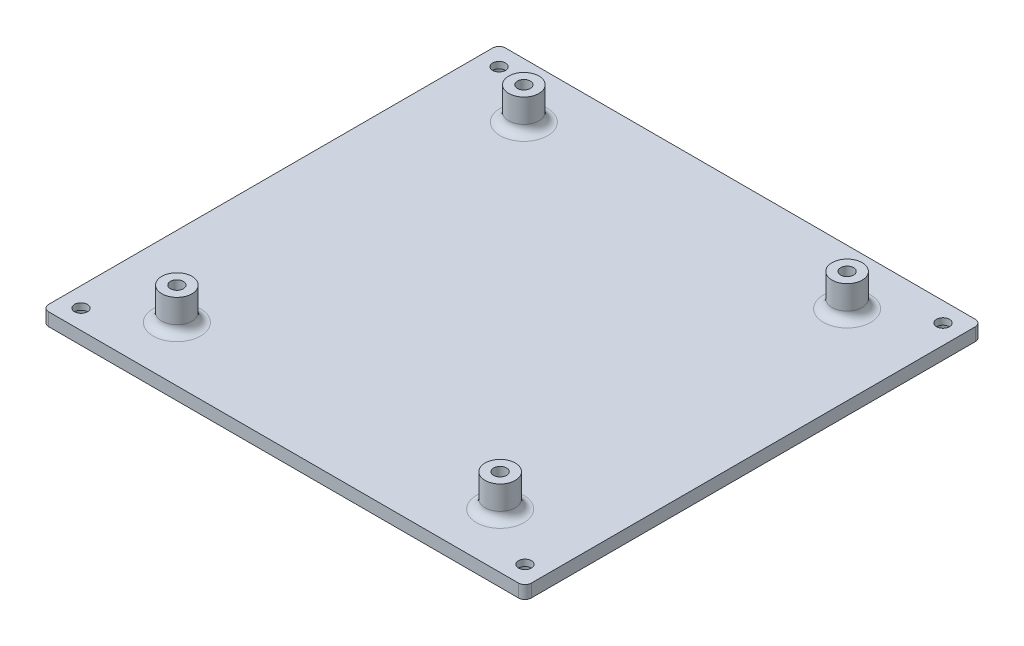
ISO-10303-21;
HEADER;
FILE_DESCRIPTION(('STEP AP214'),'2;1');
FILE_NAME('part.step','',(''),(''),'','','');
FILE_SCHEMA(('AUTOMOTIVE_DESIGN { 1 0 10303 214 1 1 1 1 }'));
ENDSEC;
DATA;
#1=APPLICATION_CONTEXT('core data for automotive mechanical design processes');
#2=APPLICATION_PROTOCOL_DEFINITION('international standard','automotive_design',2000,#1);
#3=PRODUCT_CONTEXT('',#1,'mechanical');
#4=PRODUCT('Part','Part','',(#3));
#5=PRODUCT_RELATED_PRODUCT_CATEGORY('part','',(#4));
#6=PRODUCT_DEFINITION_FORMATION('','',#4);
#7=PRODUCT_DEFINITION_CONTEXT('part definition',#1,'design');
#8=PRODUCT_DEFINITION('design','',#6,#7);
#9=PRODUCT_DEFINITION_SHAPE('','',#8);
#10=(LENGTH_UNIT() NAMED_UNIT(*) SI_UNIT(.MILLI.,.METRE.));
#11=(NAMED_UNIT(*) PLANE_ANGLE_UNIT() SI_UNIT($,.RADIAN.));
#12=(NAMED_UNIT(*) SI_UNIT($,.STERADIAN.) SOLID_ANGLE_UNIT());
#13=UNCERTAINTY_MEASURE_WITH_UNIT(LENGTH_MEASURE(1.E-05),#10,'distance_accuracy_value','');
#14=(GEOMETRIC_REPRESENTATION_CONTEXT(3) GLOBAL_UNCERTAINTY_ASSIGNED_CONTEXT((#13)) GLOBAL_UNIT_ASSIGNED_CONTEXT((#10,
#11,#12)) REPRESENTATION_CONTEXT('',''));
#15=CARTESIAN_POINT('',(0.,0.,0.));
#16=DIRECTION('',(0.,0.,1.));
#17=DIRECTION('',(1.,0.,0.));
#18=AXIS2_PLACEMENT_3D('',#15,#16,#17);
#19=CARTESIAN_POINT('',(-51.5,0.,-48.5));
#20=DIRECTION('',(0.,1.,0.));
#21=DIRECTION('',(0.,0.,1.));
#22=AXIS2_PLACEMENT_3D('',#19,#20,#21);
#23=CYLINDRICAL_SURFACE('',#22,1.5);
#24=CARTESIAN_POINT('',(-51.5,3.,-48.5));
#25=DIRECTION('',(0.,1.,0.));
#26=DIRECTION('',(0.,0.,1.));
#27=AXIS2_PLACEMENT_3D('',#24,#25,#26);
#28=CIRCLE('',#27,1.5);
#29=CARTESIAN_POINT('',(-51.5,3.,-47.));
#30=VERTEX_POINT('',#29);
#31=EDGE_CURVE('E429',#30,#30,#28,.T.);
#32=ORIENTED_EDGE('',*,*,#31,.T.);
#33=EDGE_LOOP('',(#32));
#34=FACE_BOUND('',#33,.T.);
#35=CARTESIAN_POINT('',(-51.5,1.5,-48.5));
#36=DIRECTION('',(0.,-1.,0.));
#37=DIRECTION('',(0.,0.,-1.));
#38=AXIS2_PLACEMENT_3D('',#35,#36,#37);
#39=CIRCLE('',#38,1.5);
#40=CARTESIAN_POINT('',(-51.5,1.5,-50.));
#41=VERTEX_POINT('',#40);
#42=EDGE_CURVE('E165',#41,#41,#39,.F.);
#43=ORIENTED_EDGE('',*,*,#42,.F.);
#44=EDGE_LOOP('',(#43));
#45=FACE_BOUND('',#44,.T.);
#46=ADVANCED_FACE('F45',(#34,#45),#23,.F.);
#47=CARTESIAN_POINT('',(-51.5,0.,48.5));
#48=DIRECTION('',(0.,1.,0.));
#49=DIRECTION('',(0.,0.,1.));
#50=AXIS2_PLACEMENT_3D('',#47,#48,#49);
#51=CYLINDRICAL_SURFACE('',#50,1.5);
#52=CARTESIAN_POINT('',(-51.5,3.,48.5));
#53=DIRECTION('',(0.,1.,0.));
#54=DIRECTION('',(0.,0.,1.));
#55=AXIS2_PLACEMENT_3D('',#52,#53,#54);
#56=CIRCLE('',#55,1.5);
#57=CARTESIAN_POINT('',(-51.5,3.,50.));
#58=VERTEX_POINT('',#57);
#59=EDGE_CURVE('E450',#58,#58,#56,.T.);
#60=ORIENTED_EDGE('',*,*,#59,.T.);
#61=EDGE_LOOP('',(#60));
#62=FACE_BOUND('',#61,.T.);
#63=CARTESIAN_POINT('',(-51.5,1.5,48.5));
#64=DIRECTION('',(0.,-1.,0.));
#65=DIRECTION('',(0.,0.,-1.));
#66=AXIS2_PLACEMENT_3D('',#63,#64,#65);
#67=CIRCLE('',#66,1.5);
#68=CARTESIAN_POINT('',(-51.5,1.5,47.));
#69=VERTEX_POINT('',#68);
#70=EDGE_CURVE('E161',#69,#69,#67,.F.);
#71=ORIENTED_EDGE('',*,*,#70,.F.);
#72=EDGE_LOOP('',(#71));
#73=FACE_BOUND('',#72,.T.);
#74=ADVANCED_FACE('F253',(#62,#73),#51,.F.);
#75=CARTESIAN_POINT('',(51.5,0.,48.5));
#76=DIRECTION('',(0.,1.,0.));
#77=DIRECTION('',(0.,0.,1.));
#78=AXIS2_PLACEMENT_3D('',#75,#76,#77);
#79=CYLINDRICAL_SURFACE('',#78,1.5);
#80=CARTESIAN_POINT('',(51.5,3.,48.5));
#81=DIRECTION('',(0.,1.,0.));
#82=DIRECTION('',(0.,0.,1.));
#83=AXIS2_PLACEMENT_3D('',#80,#81,#82);
#84=CIRCLE('',#83,1.5);
#85=CARTESIAN_POINT('',(51.5,3.,50.));
#86=VERTEX_POINT('',#85);
#87=EDGE_CURVE('E454',#86,#86,#84,.T.);
#88=ORIENTED_EDGE('',*,*,#87,.T.);
#89=EDGE_LOOP('',(#88));
#90=FACE_BOUND('',#89,.T.);
#91=CARTESIAN_POINT('',(51.5,1.5,48.5));
#92=DIRECTION('',(0.,-1.,0.));
#93=DIRECTION('',(0.,0.,-1.));
#94=AXIS2_PLACEMENT_3D('',#91,#92,#93);
#95=CIRCLE('',#94,1.5);
#96=CARTESIAN_POINT('',(51.5,1.5,47.));
#97=VERTEX_POINT('',#96);
#98=EDGE_CURVE('E156',#97,#97,#95,.F.);
#99=ORIENTED_EDGE('',*,*,#98,.F.);
#100=EDGE_LOOP('',(#99));
#101=FACE_BOUND('',#100,.T.);
#102=ADVANCED_FACE('F259',(#90,#101),#79,.F.);
#103=CARTESIAN_POINT('',(51.5,0.,-48.5));
#104=DIRECTION('',(0.,1.,0.));
#105=DIRECTION('',(0.,0.,1.));
#106=AXIS2_PLACEMENT_3D('',#103,#104,#105);
#107=CYLINDRICAL_SURFACE('',#106,1.5);
#108=CARTESIAN_POINT('',(51.5,3.,-48.5));
#109=DIRECTION('',(0.,1.,0.));
#110=DIRECTION('',(0.,0.,1.));
#111=AXIS2_PLACEMENT_3D('',#108,#109,#110);
#112=CIRCLE('',#111,1.5);
#113=CARTESIAN_POINT('',(51.5,3.,-47.));
#114=VERTEX_POINT('',#113);
#115=EDGE_CURVE('E169',#114,#114,#112,.T.);
#116=ORIENTED_EDGE('',*,*,#115,.T.);
#117=EDGE_LOOP('',(#116));
#118=FACE_BOUND('',#117,.T.);
#119=CARTESIAN_POINT('',(51.5,1.5,-48.5));
#120=DIRECTION('',(0.,-1.,0.));
#121=DIRECTION('',(0.,0.,-1.));
#122=AXIS2_PLACEMENT_3D('',#119,#120,#121);
#123=CIRCLE('',#122,1.5);
#124=CARTESIAN_POINT('',(51.5,1.5,-50.));
#125=VERTEX_POINT('',#124);
#126=EDGE_CURVE('E152',#125,#125,#123,.F.);
#127=ORIENTED_EDGE('',*,*,#126,.F.);
#128=EDGE_LOOP('',(#127));
#129=FACE_BOUND('',#128,.T.);
#130=ADVANCED_FACE('F266',(#118,#129),#107,.F.);
#131=CARTESIAN_POINT('',(56.,3.,53.));
#132=DIRECTION('',(-1.,0.,0.));
#133=DIRECTION('',(0.,0.,1.));
#134=AXIS2_PLACEMENT_3D('',#131,#132,#133);
#135=PLANE('',#134);
#136=DIRECTION('',(0.,0.,-1.));
#137=VECTOR('',#136,1.);
#138=CARTESIAN_POINT('',(56.,0.,53.));
#139=LINE('',#138,#137);
#140=CARTESIAN_POINT('',(56.,0.,51.5));
#141=VERTEX_POINT('',#140);
#142=CARTESIAN_POINT('',(56.,0.,-51.5));
#143=VERTEX_POINT('',#142);
#144=EDGE_CURVE('E148',#141,#143,#139,.T.);
#145=ORIENTED_EDGE('',*,*,#144,.T.);
#146=DIRECTION('',(0.,-1.,0.));
#147=VECTOR('',#146,1.);
#148=CARTESIAN_POINT('',(56.,3.,-51.5));
#149=LINE('',#148,#147);
#150=CARTESIAN_POINT('',(56.,3.,-51.5));
#151=VERTEX_POINT('',#150);
#152=EDGE_CURVE('E200',#143,#151,#149,.F.);
#153=ORIENTED_EDGE('',*,*,#152,.T.);
#154=DIRECTION('',(0.,0.,-1.));
#155=VECTOR('',#154,1.);
#156=CARTESIAN_POINT('',(56.,3.,53.));
#157=LINE('',#156,#155);
#158=CARTESIAN_POINT('',(56.,3.,51.5));
#159=VERTEX_POINT('',#158);
#160=EDGE_CURVE('E146',#159,#151,#157,.T.);
#161=ORIENTED_EDGE('',*,*,#160,.F.);
#162=DIRECTION('',(0.,-1.,0.));
#163=VECTOR('',#162,1.);
#164=CARTESIAN_POINT('',(56.,3.,51.5));
#165=LINE('',#164,#163);
#166=EDGE_CURVE('E196',#159,#141,#165,.T.);
#167=ORIENTED_EDGE('',*,*,#166,.T.);
#168=EDGE_LOOP('',(#145,#153,#161,#167));
#169=FACE_BOUND('',#168,.T.);
#170=ADVANCED_FACE('F346',(#169),#135,.F.);
#171=CARTESIAN_POINT('',(-56.,3.,-53.));
#172=DIRECTION('',(0.,0.,1.));
#173=DIRECTION('',(1.,0.,0.));
#174=AXIS2_PLACEMENT_3D('',#171,#172,#173);
#175=PLANE('',#174);
#176=DIRECTION('',(-1.,0.,0.));
#177=VECTOR('',#176,1.);
#178=CARTESIAN_POINT('',(-56.,0.,-53.));
#179=LINE('',#178,#177);
#180=CARTESIAN_POINT('',(54.5,0.,-53.));
#181=VERTEX_POINT('',#180);
#182=CARTESIAN_POINT('',(-54.5,0.,-53.));
#183=VERTEX_POINT('',#182);
#184=EDGE_CURVE('E142',#181,#183,#179,.T.);
#185=ORIENTED_EDGE('',*,*,#184,.T.);
#186=DIRECTION('',(0.,-1.,0.));
#187=VECTOR('',#186,1.);
#188=CARTESIAN_POINT('',(-54.5,3.,-53.));
#189=LINE('',#188,#187);
#190=CARTESIAN_POINT('',(-54.5,3.,-53.));
#191=VERTEX_POINT('',#190);
#192=EDGE_CURVE('E118',#183,#191,#189,.F.);
#193=ORIENTED_EDGE('',*,*,#192,.T.);
#194=DIRECTION('',(-1.,0.,0.));
#195=VECTOR('',#194,1.);
#196=CARTESIAN_POINT('',(-56.,3.,-53.));
#197=LINE('',#196,#195);
#198=CARTESIAN_POINT('',(54.5,3.,-53.));
#199=VERTEX_POINT('',#198);
#200=EDGE_CURVE('E394',#199,#191,#197,.T.);
#201=ORIENTED_EDGE('',*,*,#200,.F.);
#202=DIRECTION('',(0.,-1.,0.));
#203=VECTOR('',#202,1.);
#204=CARTESIAN_POINT('',(54.5,3.,-53.));
#205=LINE('',#204,#203);
#206=EDGE_CURVE('E124',#199,#181,#205,.T.);
#207=ORIENTED_EDGE('',*,*,#206,.T.);
#208=EDGE_LOOP('',(#185,#193,#201,#207));
#209=FACE_BOUND('',#208,.T.);
#210=ADVANCED_FACE('F343',(#209),#175,.F.);
#211=CARTESIAN_POINT('',(-56.,3.,53.));
#212=DIRECTION('',(1.,0.,0.));
#213=DIRECTION('',(0.,0.,-1.));
#214=AXIS2_PLACEMENT_3D('',#211,#212,#213);
#215=PLANE('',#214);
#216=DIRECTION('',(0.,0.,1.));
#217=VECTOR('',#216,1.);
#218=CARTESIAN_POINT('',(-56.,3.,53.));
#219=LINE('',#218,#217);
#220=CARTESIAN_POINT('',(-56.,3.,-51.5));
#221=VERTEX_POINT('',#220);
#222=CARTESIAN_POINT('',(-56.,3.,51.5));
#223=VERTEX_POINT('',#222);
#224=EDGE_CURVE('E133',#221,#223,#219,.T.);
#225=ORIENTED_EDGE('',*,*,#224,.F.);
#226=DIRECTION('',(0.,-1.,0.));
#227=VECTOR('',#226,1.);
#228=CARTESIAN_POINT('',(-56.,3.,-51.5));
#229=LINE('',#228,#227);
#230=CARTESIAN_POINT('',(-56.,0.,-51.5));
#231=VERTEX_POINT('',#230);
#232=EDGE_CURVE('E117',#221,#231,#229,.T.);
#233=ORIENTED_EDGE('',*,*,#232,.T.);
#234=DIRECTION('',(0.,0.,1.));
#235=VECTOR('',#234,1.);
#236=CARTESIAN_POINT('',(-56.,0.,53.));
#237=LINE('',#236,#235);
#238=CARTESIAN_POINT('',(-56.,0.,51.5));
#239=VERTEX_POINT('',#238);
#240=EDGE_CURVE('E131',#231,#239,#237,.T.);
#241=ORIENTED_EDGE('',*,*,#240,.T.);
#242=DIRECTION('',(0.,-1.,0.));
#243=VECTOR('',#242,1.);
#244=CARTESIAN_POINT('',(-56.,3.,51.5));
#245=LINE('',#244,#243);
#246=EDGE_CURVE('E136',#239,#223,#245,.F.);
#247=ORIENTED_EDGE('',*,*,#246,.T.);
#248=EDGE_LOOP('',(#225,#233,#241,#247));
#249=FACE_BOUND('',#248,.T.);
#250=ADVANCED_FACE('F130',(#249),#215,.F.);
#251=CARTESIAN_POINT('',(-56.,3.,53.));
#252=DIRECTION('',(0.,0.,-1.));
#253=DIRECTION('',(-1.,0.,0.));
#254=AXIS2_PLACEMENT_3D('',#251,#252,#253);
#255=PLANE('',#254);
#256=DIRECTION('',(1.,0.,0.));
#257=VECTOR('',#256,1.);
#258=CARTESIAN_POINT('',(-56.,0.,53.));
#259=LINE('',#258,#257);
#260=CARTESIAN_POINT('',(-54.5,0.,53.));
#261=VERTEX_POINT('',#260);
#262=CARTESIAN_POINT('',(54.5,0.,53.));
#263=VERTEX_POINT('',#262);
#264=EDGE_CURVE('E141',#261,#263,#259,.T.);
#265=ORIENTED_EDGE('',*,*,#264,.T.);
#266=DIRECTION('',(0.,-1.,0.));
#267=VECTOR('',#266,1.);
#268=CARTESIAN_POINT('',(54.5,3.,53.));
#269=LINE('',#268,#267);
#270=CARTESIAN_POINT('',(54.5,3.,53.));
#271=VERTEX_POINT('',#270);
#272=EDGE_CURVE('E61',#263,#271,#269,.F.);
#273=ORIENTED_EDGE('',*,*,#272,.T.);
#274=DIRECTION('',(1.,0.,0.));
#275=VECTOR('',#274,1.);
#276=CARTESIAN_POINT('',(-56.,3.,53.));
#277=LINE('',#276,#275);
#278=CARTESIAN_POINT('',(-54.5,3.,53.));
#279=VERTEX_POINT('',#278);
#280=EDGE_CURVE('E171',#279,#271,#277,.T.);
#281=ORIENTED_EDGE('',*,*,#280,.F.);
#282=DIRECTION('',(0.,-1.,0.));
#283=VECTOR('',#282,1.);
#284=CARTESIAN_POINT('',(-54.5,3.,53.));
#285=LINE('',#284,#283);
#286=EDGE_CURVE('E203',#279,#261,#285,.T.);
#287=ORIENTED_EDGE('',*,*,#286,.T.);
#288=EDGE_LOOP('',(#265,#273,#281,#287));
#289=FACE_BOUND('',#288,.T.);
#290=ADVANCED_FACE('F334',(#289),#255,.F.);
#291=CARTESIAN_POINT('',(0.,3.,0.));
#292=DIRECTION('',(0.,-1.,0.));
#293=DIRECTION('',(0.,0.,-1.));
#294=AXIS2_PLACEMENT_3D('',#291,#292,#293);
#295=PLANE('',#294);
#296=CARTESIAN_POINT('',(37.5,3.,-40.25));
#297=DIRECTION('',(0.,-1.,0.));
#298=DIRECTION('',(0.,0.,-1.));
#299=AXIS2_PLACEMENT_3D('',#296,#297,#298);
#300=CIRCLE('',#299,5.5);
#301=CARTESIAN_POINT('',(37.5,3.,-45.75));
#302=VERTEX_POINT('',#301);
#303=EDGE_CURVE('E225',#302,#302,#300,.T.);
#304=ORIENTED_EDGE('',*,*,#303,.T.);
#305=EDGE_LOOP('',(#304));
#306=FACE_BOUND('',#305,.T.);
#307=CARTESIAN_POINT('',(37.5,3.,40.25));
#308=DIRECTION('',(0.,-1.,0.));
#309=DIRECTION('',(0.,0.,-1.));
#310=AXIS2_PLACEMENT_3D('',#307,#308,#309);
#311=CIRCLE('',#310,5.5);
#312=CARTESIAN_POINT('',(37.5,3.,34.75));
#313=VERTEX_POINT('',#312);
#314=EDGE_CURVE('E221',#313,#313,#311,.T.);
#315=ORIENTED_EDGE('',*,*,#314,.T.);
#316=EDGE_LOOP('',(#315));
#317=FACE_BOUND('',#316,.T.);
#318=CARTESIAN_POINT('',(-37.5,3.,-40.25));
#319=DIRECTION('',(0.,-1.,0.));
#320=DIRECTION('',(0.,0.,-1.));
#321=AXIS2_PLACEMENT_3D('',#318,#319,#320);
#322=CIRCLE('',#321,5.5);
#323=CARTESIAN_POINT('',(-37.5,3.,-45.75));
#324=VERTEX_POINT('',#323);
#325=EDGE_CURVE('E217',#324,#324,#322,.T.);
#326=ORIENTED_EDGE('',*,*,#325,.T.);
#327=EDGE_LOOP('',(#326));
#328=FACE_BOUND('',#327,.T.);
#329=CARTESIAN_POINT('',(-37.5,3.,40.25));
#330=DIRECTION('',(0.,-1.,0.));
#331=DIRECTION('',(0.,0.,-1.));
#332=AXIS2_PLACEMENT_3D('',#329,#330,#331);
#333=CIRCLE('',#332,5.5);
#334=CARTESIAN_POINT('',(-37.5,3.,34.75));
#335=VERTEX_POINT('',#334);
#336=EDGE_CURVE('E213',#335,#335,#333,.T.);
#337=ORIENTED_EDGE('',*,*,#336,.T.);
#338=EDGE_LOOP('',(#337));
#339=FACE_BOUND('',#338,.T.);
#340=ORIENTED_EDGE('',*,*,#115,.F.);
#341=EDGE_LOOP('',(#340));
#342=FACE_BOUND('',#341,.T.);
#343=ORIENTED_EDGE('',*,*,#87,.F.);
#344=EDGE_LOOP('',(#343));
#345=FACE_BOUND('',#344,.T.);
#346=ORIENTED_EDGE('',*,*,#59,.F.);
#347=EDGE_LOOP('',(#346));
#348=FACE_BOUND('',#347,.T.);
#349=ORIENTED_EDGE('',*,*,#31,.F.);
#350=EDGE_LOOP('',(#349));
#351=FACE_BOUND('',#350,.T.);
#352=ORIENTED_EDGE('',*,*,#200,.T.);
#353=CARTESIAN_POINT('',(-54.5,3.,-51.5));
#354=DIRECTION('',(0.,-1.,0.));
#355=DIRECTION('',(0.,0.,-1.));
#356=AXIS2_PLACEMENT_3D('',#353,#354,#355);
#357=CIRCLE('',#356,1.5);
#358=EDGE_CURVE('E193',#191,#221,#357,.F.);
#359=ORIENTED_EDGE('',*,*,#358,.T.);
#360=ORIENTED_EDGE('',*,*,#224,.T.);
#361=CARTESIAN_POINT('',(-54.5,3.,51.5));
#362=DIRECTION('',(0.,-1.,0.));
#363=DIRECTION('',(0.,0.,-1.));
#364=AXIS2_PLACEMENT_3D('',#361,#362,#363);
#365=CIRCLE('',#364,1.5);
#366=EDGE_CURVE('E68',#223,#279,#365,.F.);
#367=ORIENTED_EDGE('',*,*,#366,.T.);
#368=ORIENTED_EDGE('',*,*,#280,.T.);
#369=CARTESIAN_POINT('',(54.5,3.,51.5));
#370=DIRECTION('',(0.,-1.,0.));
#371=DIRECTION('',(0.,0.,-1.));
#372=AXIS2_PLACEMENT_3D('',#369,#370,#371);
#373=CIRCLE('',#372,1.5);
#374=EDGE_CURVE('E187',#271,#159,#373,.F.);
#375=ORIENTED_EDGE('',*,*,#374,.T.);
#376=ORIENTED_EDGE('',*,*,#160,.T.);
#377=CARTESIAN_POINT('',(54.5,3.,-51.5));
#378=DIRECTION('',(0.,-1.,0.));
#379=DIRECTION('',(0.,0.,-1.));
#380=AXIS2_PLACEMENT_3D('',#377,#378,#379);
#381=CIRCLE('',#380,1.5);
#382=EDGE_CURVE('E190',#151,#199,#381,.F.);
#383=ORIENTED_EDGE('',*,*,#382,.T.);
#384=EDGE_LOOP('',(#352,#359,#360,#367,#368,#375,#376,#383));
#385=FACE_BOUND('',#384,.T.);
#386=ADVANCED_FACE('F331',(#306,#317,#328,#339,#342,#345,#348,#351,#385),#295,.F.);
#387=CARTESIAN_POINT('',(0.,0.,0.));
#388=DIRECTION('',(0.,-1.,0.));
#389=DIRECTION('',(0.,0.,-1.));
#390=AXIS2_PLACEMENT_3D('',#387,#388,#389);
#391=PLANE('',#390);
#392=CARTESIAN_POINT('',(51.5,0.,48.5));
#393=DIRECTION('',(0.,-1.,0.));
#394=DIRECTION('',(0.,0.,-1.));
#395=AXIS2_PLACEMENT_3D('',#392,#393,#394);
#396=CIRCLE('',#395,2.5);
#397=CARTESIAN_POINT('',(51.5,0.,46.));
#398=VERTEX_POINT('',#397);
#399=EDGE_CURVE('E469',#398,#398,#396,.T.);
#400=ORIENTED_EDGE('',*,*,#399,.F.);
#401=EDGE_LOOP('',(#400));
#402=FACE_BOUND('',#401,.T.);
#403=CARTESIAN_POINT('',(51.5,0.,-48.5));
#404=DIRECTION('',(0.,-1.,0.));
#405=DIRECTION('',(0.,0.,-1.));
#406=AXIS2_PLACEMENT_3D('',#403,#404,#405);
#407=CIRCLE('',#406,2.5);
#408=CARTESIAN_POINT('',(51.5,0.,-51.));
#409=VERTEX_POINT('',#408);
#410=EDGE_CURVE('E477',#409,#409,#407,.T.);
#411=ORIENTED_EDGE('',*,*,#410,.F.);
#412=EDGE_LOOP('',(#411));
#413=FACE_BOUND('',#412,.T.);
#414=CARTESIAN_POINT('',(-51.5,0.,-48.5));
#415=DIRECTION('',(0.,-1.,0.));
#416=DIRECTION('',(0.,0.,-1.));
#417=AXIS2_PLACEMENT_3D('',#414,#415,#416);
#418=CIRCLE('',#417,2.5);
#419=CARTESIAN_POINT('',(-51.5,0.,-51.));
#420=VERTEX_POINT('',#419);
#421=EDGE_CURVE('E485',#420,#420,#418,.T.);
#422=ORIENTED_EDGE('',*,*,#421,.F.);
#423=EDGE_LOOP('',(#422));
#424=FACE_BOUND('',#423,.T.);
#425=CARTESIAN_POINT('',(-51.5,0.,48.5));
#426=DIRECTION('',(0.,-1.,0.));
#427=DIRECTION('',(0.,0.,-1.));
#428=AXIS2_PLACEMENT_3D('',#425,#426,#427);
#429=CIRCLE('',#428,2.5);
#430=CARTESIAN_POINT('',(-51.5,0.,46.));
#431=VERTEX_POINT('',#430);
#432=EDGE_CURVE('E461',#431,#431,#429,.T.);
#433=ORIENTED_EDGE('',*,*,#432,.F.);
#434=EDGE_LOOP('',(#433));
#435=FACE_BOUND('',#434,.T.);
#436=ORIENTED_EDGE('',*,*,#240,.F.);
#437=CARTESIAN_POINT('',(-54.5,0.,-51.5));
#438=DIRECTION('',(0.,-1.,0.));
#439=DIRECTION('',(0.,0.,-1.));
#440=AXIS2_PLACEMENT_3D('',#437,#438,#439);
#441=CIRCLE('',#440,1.5);
#442=EDGE_CURVE('E113',#231,#183,#441,.T.);
#443=ORIENTED_EDGE('',*,*,#442,.T.);
#444=ORIENTED_EDGE('',*,*,#184,.F.);
#445=CARTESIAN_POINT('',(54.5,0.,-51.5));
#446=DIRECTION('',(0.,-1.,0.));
#447=DIRECTION('',(0.,0.,-1.));
#448=AXIS2_PLACEMENT_3D('',#445,#446,#447);
#449=CIRCLE('',#448,1.5);
#450=EDGE_CURVE('E125',#181,#143,#449,.T.);
#451=ORIENTED_EDGE('',*,*,#450,.T.);
#452=ORIENTED_EDGE('',*,*,#144,.F.);
#453=CARTESIAN_POINT('',(54.5,0.,51.5));
#454=DIRECTION('',(0.,-1.,0.));
#455=DIRECTION('',(0.,0.,-1.));
#456=AXIS2_PLACEMENT_3D('',#453,#454,#455);
#457=CIRCLE('',#456,1.5);
#458=EDGE_CURVE('E175',#141,#263,#457,.T.);
#459=ORIENTED_EDGE('',*,*,#458,.T.);
#460=ORIENTED_EDGE('',*,*,#264,.F.);
#461=CARTESIAN_POINT('',(-54.5,0.,51.5));
#462=DIRECTION('',(0.,-1.,0.));
#463=DIRECTION('',(0.,0.,-1.));
#464=AXIS2_PLACEMENT_3D('',#461,#462,#463);
#465=CIRCLE('',#464,1.5);
#466=EDGE_CURVE('E135',#261,#239,#465,.T.);
#467=ORIENTED_EDGE('',*,*,#466,.T.);
#468=EDGE_LOOP('',(#436,#443,#444,#451,#452,#459,#460,#467));
#469=FACE_BOUND('',#468,.T.);
#470=ADVANCED_FACE('F138',(#402,#413,#424,#435,#469),#391,.T.);
#471=CARTESIAN_POINT('',(-37.5,10.5,-40.25));
#472=DIRECTION('',(0.,-1.,0.));
#473=DIRECTION('',(0.,0.,-1.));
#474=AXIS2_PLACEMENT_3D('',#471,#472,#473);
#475=CYLINDRICAL_SURFACE('',#474,3.5);
#476=CARTESIAN_POINT('',(-37.5,5.,-40.25));
#477=DIRECTION('',(0.,-1.,0.));
#478=DIRECTION('',(0.,0.,-1.));
#479=AXIS2_PLACEMENT_3D('',#476,#477,#478);
#480=CIRCLE('',#479,3.5);
#481=CARTESIAN_POINT('',(-37.5,5.,-43.75));
#482=VERTEX_POINT('',#481);
#483=EDGE_CURVE('E54',#482,#482,#480,.F.);
#484=ORIENTED_EDGE('',*,*,#483,.T.);
#485=EDGE_LOOP('',(#484));
#486=FACE_BOUND('',#485,.T.);
#487=CARTESIAN_POINT('',(-37.5,10.5,-40.25));
#488=DIRECTION('',(0.,1.,0.));
#489=DIRECTION('',(0.,0.,1.));
#490=AXIS2_PLACEMENT_3D('',#487,#488,#489);
#491=CIRCLE('',#490,3.5);
#492=CARTESIAN_POINT('',(-37.5,10.5,-36.75));
#493=VERTEX_POINT('',#492);
#494=EDGE_CURVE('E379',#493,#493,#491,.T.);
#495=ORIENTED_EDGE('',*,*,#494,.F.);
#496=EDGE_LOOP('',(#495));
#497=FACE_BOUND('',#496,.T.);
#498=ADVANCED_FACE('F236',(#486,#497),#475,.T.);
#499=CARTESIAN_POINT('',(0.,10.5,0.));
#500=DIRECTION('',(0.,1.,0.));
#501=DIRECTION('',(0.,0.,1.));
#502=AXIS2_PLACEMENT_3D('',#499,#500,#501);
#503=PLANE('',#502);
#504=CARTESIAN_POINT('',(-37.5,10.5,-40.25));
#505=DIRECTION('',(0.,1.,0.));
#506=DIRECTION('',(0.,0.,1.));
#507=AXIS2_PLACEMENT_3D('',#504,#505,#506);
#508=CIRCLE('',#507,1.5);
#509=CARTESIAN_POINT('',(-37.5,10.5,-38.75));
#510=VERTEX_POINT('',#509);
#511=EDGE_CURVE('E416',#510,#510,#508,.T.);
#512=ORIENTED_EDGE('',*,*,#511,.F.);
#513=EDGE_LOOP('',(#512));
#514=FACE_BOUND('',#513,.T.);
#515=ORIENTED_EDGE('',*,*,#494,.T.);
#516=EDGE_LOOP('',(#515));
#517=FACE_BOUND('',#516,.T.);
#518=ADVANCED_FACE('F324',(#514,#517),#503,.T.);
#519=CARTESIAN_POINT('',(37.5,10.5,-40.25));
#520=DIRECTION('',(0.,-1.,0.));
#521=DIRECTION('',(0.,0.,-1.));
#522=AXIS2_PLACEMENT_3D('',#519,#520,#521);
#523=CYLINDRICAL_SURFACE('',#522,3.5);
#524=CARTESIAN_POINT('',(37.5,5.,-40.25));
#525=DIRECTION('',(0.,-1.,0.));
#526=DIRECTION('',(0.,0.,-1.));
#527=AXIS2_PLACEMENT_3D('',#524,#525,#526);
#528=CIRCLE('',#527,3.5);
#529=CARTESIAN_POINT('',(37.5,5.,-43.75));
#530=VERTEX_POINT('',#529);
#531=EDGE_CURVE('E209',#530,#530,#528,.F.);
#532=ORIENTED_EDGE('',*,*,#531,.T.);
#533=EDGE_LOOP('',(#532));
#534=FACE_BOUND('',#533,.T.);
#535=CARTESIAN_POINT('',(37.5,10.5,-40.25));
#536=DIRECTION('',(0.,1.,0.));
#537=DIRECTION('',(0.,0.,1.));
#538=AXIS2_PLACEMENT_3D('',#535,#536,#537);
#539=CIRCLE('',#538,3.5);
#540=CARTESIAN_POINT('',(37.5,10.5,-36.75));
#541=VERTEX_POINT('',#540);
#542=EDGE_CURVE('E376',#541,#541,#539,.T.);
#543=ORIENTED_EDGE('',*,*,#542,.F.);
#544=EDGE_LOOP('',(#543));
#545=FACE_BOUND('',#544,.T.);
#546=ADVANCED_FACE('F320',(#534,#545),#523,.T.);
#547=CARTESIAN_POINT('',(0.,10.5,0.));
#548=DIRECTION('',(0.,1.,0.));
#549=DIRECTION('',(0.,0.,1.));
#550=AXIS2_PLACEMENT_3D('',#547,#548,#549);
#551=PLANE('',#550);
#552=CARTESIAN_POINT('',(37.5,10.5,-40.25));
#553=DIRECTION('',(0.,1.,0.));
#554=DIRECTION('',(0.,0.,1.));
#555=AXIS2_PLACEMENT_3D('',#552,#553,#554);
#556=CIRCLE('',#555,1.5);
#557=CARTESIAN_POINT('',(37.5,10.5,-38.75));
#558=VERTEX_POINT('',#557);
#559=EDGE_CURVE('E420',#558,#558,#556,.T.);
#560=ORIENTED_EDGE('',*,*,#559,.F.);
#561=EDGE_LOOP('',(#560));
#562=FACE_BOUND('',#561,.T.);
#563=ORIENTED_EDGE('',*,*,#542,.T.);
#564=EDGE_LOOP('',(#563));
#565=FACE_BOUND('',#564,.T.);
#566=ADVANCED_FACE('F316',(#562,#565),#551,.T.);
#567=CARTESIAN_POINT('',(-37.5,10.5,40.25));
#568=DIRECTION('',(0.,-1.,0.));
#569=DIRECTION('',(0.,0.,-1.));
#570=AXIS2_PLACEMENT_3D('',#567,#568,#569);
#571=CYLINDRICAL_SURFACE('',#570,3.5);
#572=CARTESIAN_POINT('',(-37.5,5.,40.25));
#573=DIRECTION('',(0.,-1.,0.));
#574=DIRECTION('',(0.,0.,-1.));
#575=AXIS2_PLACEMENT_3D('',#572,#573,#574);
#576=CIRCLE('',#575,3.5);
#577=CARTESIAN_POINT('',(-37.5,5.,36.75));
#578=VERTEX_POINT('',#577);
#579=EDGE_CURVE('E11',#578,#578,#576,.F.);
#580=ORIENTED_EDGE('',*,*,#579,.T.);
#581=EDGE_LOOP('',(#580));
#582=FACE_BOUND('',#581,.T.);
#583=CARTESIAN_POINT('',(-37.5,10.5,40.25));
#584=DIRECTION('',(0.,1.,0.));
#585=DIRECTION('',(0.,0.,1.));
#586=AXIS2_PLACEMENT_3D('',#583,#584,#585);
#587=CIRCLE('',#586,3.5);
#588=CARTESIAN_POINT('',(-37.5,10.5,43.75));
#589=VERTEX_POINT('',#588);
#590=EDGE_CURVE('E380',#589,#589,#587,.T.);
#591=ORIENTED_EDGE('',*,*,#590,.F.);
#592=EDGE_LOOP('',(#591));
#593=FACE_BOUND('',#592,.T.);
#594=ADVANCED_FACE('F312',(#582,#593),#571,.T.);
#595=CARTESIAN_POINT('',(0.,10.5,0.));
#596=DIRECTION('',(0.,1.,0.));
#597=DIRECTION('',(0.,0.,1.));
#598=AXIS2_PLACEMENT_3D('',#595,#596,#597);
#599=PLANE('',#598);
#600=CARTESIAN_POINT('',(-37.5,10.5,40.25));
#601=DIRECTION('',(0.,1.,0.));
#602=DIRECTION('',(0.,0.,1.));
#603=AXIS2_PLACEMENT_3D('',#600,#601,#602);
#604=CIRCLE('',#603,1.5);
#605=CARTESIAN_POINT('',(-37.5,10.5,41.75));
#606=VERTEX_POINT('',#605);
#607=EDGE_CURVE('E428',#606,#606,#604,.T.);
#608=ORIENTED_EDGE('',*,*,#607,.F.);
#609=EDGE_LOOP('',(#608));
#610=FACE_BOUND('',#609,.T.);
#611=ORIENTED_EDGE('',*,*,#590,.T.);
#612=EDGE_LOOP('',(#611));
#613=FACE_BOUND('',#612,.T.);
#614=ADVANCED_FACE('F308',(#610,#613),#599,.T.);
#615=CARTESIAN_POINT('',(37.5,10.5,40.25));
#616=DIRECTION('',(0.,-1.,0.));
#617=DIRECTION('',(0.,0.,-1.));
#618=AXIS2_PLACEMENT_3D('',#615,#616,#617);
#619=CYLINDRICAL_SURFACE('',#618,3.5);
#620=CARTESIAN_POINT('',(37.5,5.,40.25));
#621=DIRECTION('',(0.,-1.,0.));
#622=DIRECTION('',(0.,0.,-1.));
#623=AXIS2_PLACEMENT_3D('',#620,#621,#622);
#624=CIRCLE('',#623,3.5);
#625=CARTESIAN_POINT('',(37.5,5.,36.75));
#626=VERTEX_POINT('',#625);
#627=EDGE_CURVE('E229',#626,#626,#624,.F.);
#628=ORIENTED_EDGE('',*,*,#627,.T.);
#629=EDGE_LOOP('',(#628));
#630=FACE_BOUND('',#629,.T.);
#631=CARTESIAN_POINT('',(37.5,10.5,40.25));
#632=DIRECTION('',(0.,1.,0.));
#633=DIRECTION('',(0.,0.,1.));
#634=AXIS2_PLACEMENT_3D('',#631,#632,#633);
#635=CIRCLE('',#634,3.5);
#636=CARTESIAN_POINT('',(37.5,10.5,43.75));
#637=VERTEX_POINT('',#636);
#638=EDGE_CURVE('E387',#637,#637,#635,.T.);
#639=ORIENTED_EDGE('',*,*,#638,.F.);
#640=EDGE_LOOP('',(#639));
#641=FACE_BOUND('',#640,.T.);
#642=ADVANCED_FACE('F304',(#630,#641),#619,.T.);
#643=CARTESIAN_POINT('',(0.,10.5,0.));
#644=DIRECTION('',(0.,1.,0.));
#645=DIRECTION('',(0.,0.,1.));
#646=AXIS2_PLACEMENT_3D('',#643,#644,#645);
#647=PLANE('',#646);
#648=CARTESIAN_POINT('',(37.5,10.5,40.25));
#649=DIRECTION('',(0.,1.,0.));
#650=DIRECTION('',(0.,0.,1.));
#651=AXIS2_PLACEMENT_3D('',#648,#649,#650);
#652=CIRCLE('',#651,1.5);
#653=CARTESIAN_POINT('',(37.5,10.5,41.75));
#654=VERTEX_POINT('',#653);
#655=EDGE_CURVE('E437',#654,#654,#652,.T.);
#656=ORIENTED_EDGE('',*,*,#655,.F.);
#657=EDGE_LOOP('',(#656));
#658=FACE_BOUND('',#657,.T.);
#659=ORIENTED_EDGE('',*,*,#638,.T.);
#660=EDGE_LOOP('',(#659));
#661=FACE_BOUND('',#660,.T.);
#662=ADVANCED_FACE('F282',(#658,#661),#647,.T.);
#663=CARTESIAN_POINT('',(37.5,5.5,40.25));
#664=DIRECTION('',(0.,1.,0.));
#665=DIRECTION('',(0.,0.,1.));
#666=AXIS2_PLACEMENT_3D('',#663,#664,#665);
#667=CYLINDRICAL_SURFACE('',#666,1.5);
#668=CARTESIAN_POINT('',(37.5,5.5,40.25));
#669=DIRECTION('',(0.,1.,0.));
#670=DIRECTION('',(0.,0.,1.));
#671=AXIS2_PLACEMENT_3D('',#668,#669,#670);
#672=CIRCLE('',#671,1.5);
#673=CARTESIAN_POINT('',(37.5,5.5,41.75));
#674=VERTEX_POINT('',#673);
#675=EDGE_CURVE('E433',#674,#674,#672,.T.);
#676=ORIENTED_EDGE('',*,*,#675,.F.);
#677=EDGE_LOOP('',(#676));
#678=FACE_BOUND('',#677,.T.);
#679=ORIENTED_EDGE('',*,*,#655,.T.);
#680=EDGE_LOOP('',(#679));
#681=FACE_BOUND('',#680,.T.);
#682=ADVANCED_FACE('F278',(#678,#681),#667,.F.);
#683=CARTESIAN_POINT('',(37.5,5.5,40.25));
#684=DIRECTION('',(0.,1.,0.));
#685=DIRECTION('',(0.,0.,1.));
#686=AXIS2_PLACEMENT_3D('',#683,#684,#685);
#687=PLANE('',#686);
#688=ORIENTED_EDGE('',*,*,#675,.T.);
#689=EDGE_LOOP('',(#688));
#690=FACE_BOUND('',#689,.T.);
#691=ADVANCED_FACE('F281',(#690),#687,.T.);
#692=CARTESIAN_POINT('',(-37.5,5.5,40.25));
#693=DIRECTION('',(0.,1.,0.));
#694=DIRECTION('',(0.,0.,1.));
#695=AXIS2_PLACEMENT_3D('',#692,#693,#694);
#696=CYLINDRICAL_SURFACE('',#695,1.5);
#697=CARTESIAN_POINT('',(-37.5,5.5,40.25));
#698=DIRECTION('',(0.,1.,0.));
#699=DIRECTION('',(0.,0.,1.));
#700=AXIS2_PLACEMENT_3D('',#697,#698,#699);
#701=CIRCLE('',#700,1.5);
#702=CARTESIAN_POINT('',(-37.5,5.5,41.75));
#703=VERTEX_POINT('',#702);
#704=EDGE_CURVE('E424',#703,#703,#701,.T.);
#705=ORIENTED_EDGE('',*,*,#704,.F.);
#706=EDGE_LOOP('',(#705));
#707=FACE_BOUND('',#706,.T.);
#708=ORIENTED_EDGE('',*,*,#607,.T.);
#709=EDGE_LOOP('',(#708));
#710=FACE_BOUND('',#709,.T.);
#711=ADVANCED_FACE('F286',(#707,#710),#696,.F.);
#712=CARTESIAN_POINT('',(-37.5,5.5,40.25));
#713=DIRECTION('',(0.,1.,0.));
#714=DIRECTION('',(0.,0.,1.));
#715=AXIS2_PLACEMENT_3D('',#712,#713,#714);
#716=PLANE('',#715);
#717=ORIENTED_EDGE('',*,*,#704,.T.);
#718=EDGE_LOOP('',(#717));
#719=FACE_BOUND('',#718,.T.);
#720=ADVANCED_FACE('F272',(#719),#716,.T.);
#721=CARTESIAN_POINT('',(37.5,5.5,-40.25));
#722=DIRECTION('',(0.,1.,0.));
#723=DIRECTION('',(0.,0.,1.));
#724=AXIS2_PLACEMENT_3D('',#721,#722,#723);
#725=CYLINDRICAL_SURFACE('',#724,1.5);
#726=CARTESIAN_POINT('',(37.5,5.5,-40.25));
#727=DIRECTION('',(0.,1.,0.));
#728=DIRECTION('',(0.,0.,1.));
#729=AXIS2_PLACEMENT_3D('',#726,#727,#728);
#730=CIRCLE('',#729,1.5);
#731=CARTESIAN_POINT('',(37.5,5.5,-38.75));
#732=VERTEX_POINT('',#731);
#733=EDGE_CURVE('E441',#732,#732,#730,.T.);
#734=ORIENTED_EDGE('',*,*,#733,.F.);
#735=EDGE_LOOP('',(#734));
#736=FACE_BOUND('',#735,.T.);
#737=ORIENTED_EDGE('',*,*,#559,.T.);
#738=EDGE_LOOP('',(#737));
#739=FACE_BOUND('',#738,.T.);
#740=ADVANCED_FACE('F268',(#736,#739),#725,.F.);
#741=CARTESIAN_POINT('',(37.5,5.5,-40.25));
#742=DIRECTION('',(0.,1.,0.));
#743=DIRECTION('',(0.,0.,1.));
#744=AXIS2_PLACEMENT_3D('',#741,#742,#743);
#745=PLANE('',#744);
#746=ORIENTED_EDGE('',*,*,#733,.T.);
#747=EDGE_LOOP('',(#746));
#748=FACE_BOUND('',#747,.T.);
#749=ADVANCED_FACE('F271',(#748),#745,.T.);
#750=CARTESIAN_POINT('',(-37.5,5.5,-40.25));
#751=DIRECTION('',(0.,1.,0.));
#752=DIRECTION('',(0.,0.,1.));
#753=AXIS2_PLACEMENT_3D('',#750,#751,#752);
#754=CYLINDRICAL_SURFACE('',#753,1.5);
#755=CARTESIAN_POINT('',(-37.5,5.5,-40.25));
#756=DIRECTION('',(0.,1.,0.));
#757=DIRECTION('',(0.,0.,1.));
#758=AXIS2_PLACEMENT_3D('',#755,#756,#757);
#759=CIRCLE('',#758,1.5);
#760=CARTESIAN_POINT('',(-37.5,5.5,-38.75));
#761=VERTEX_POINT('',#760);
#762=EDGE_CURVE('E415',#761,#761,#759,.T.);
#763=ORIENTED_EDGE('',*,*,#762,.F.);
#764=EDGE_LOOP('',(#763));
#765=FACE_BOUND('',#764,.T.);
#766=ORIENTED_EDGE('',*,*,#511,.T.);
#767=EDGE_LOOP('',(#766));
#768=FACE_BOUND('',#767,.T.);
#769=ADVANCED_FACE('F276',(#765,#768),#754,.F.);
#770=CARTESIAN_POINT('',(-37.5,5.5,-40.25));
#771=DIRECTION('',(0.,1.,0.));
#772=DIRECTION('',(0.,0.,1.));
#773=AXIS2_PLACEMENT_3D('',#770,#771,#772);
#774=PLANE('',#773);
#775=ORIENTED_EDGE('',*,*,#762,.T.);
#776=EDGE_LOOP('',(#775));
#777=FACE_BOUND('',#776,.T.);
#778=ADVANCED_FACE('F294',(#777),#774,.T.);
#779=CARTESIAN_POINT('',(0.,1.5,0.));
#780=DIRECTION('',(0.,-1.,0.));
#781=DIRECTION('',(0.,0.,-1.));
#782=AXIS2_PLACEMENT_3D('',#779,#780,#781);
#783=PLANE('',#782);
#784=CARTESIAN_POINT('',(51.5,1.5,-48.5));
#785=DIRECTION('',(0.,-1.,0.));
#786=DIRECTION('',(0.,0.,-1.));
#787=AXIS2_PLACEMENT_3D('',#784,#785,#786);
#788=CIRCLE('',#787,2.5);
#789=CARTESIAN_POINT('',(51.5,1.5,-51.));
#790=VERTEX_POINT('',#789);
#791=EDGE_CURVE('E481',#790,#790,#788,.T.);
#792=ORIENTED_EDGE('',*,*,#791,.T.);
#793=EDGE_LOOP('',(#792));
#794=FACE_BOUND('',#793,.T.);
#795=ORIENTED_EDGE('',*,*,#126,.T.);
#796=EDGE_LOOP('',(#795));
#797=FACE_BOUND('',#796,.T.);
#798=ADVANCED_FACE('F297',(#794,#797),#783,.T.);
#799=CARTESIAN_POINT('',(51.5,1.5,-48.5));
#800=DIRECTION('',(0.,-1.,0.));
#801=DIRECTION('',(0.,0.,-1.));
#802=AXIS2_PLACEMENT_3D('',#799,#800,#801);
#803=CYLINDRICAL_SURFACE('',#802,2.5);
#804=ORIENTED_EDGE('',*,*,#791,.F.);
#805=EDGE_LOOP('',(#804));
#806=FACE_BOUND('',#805,.T.);
#807=ORIENTED_EDGE('',*,*,#410,.T.);
#808=EDGE_LOOP('',(#807));
#809=FACE_BOUND('',#808,.T.);
#810=ADVANCED_FACE('F531',(#806,#809),#803,.F.);
#811=CARTESIAN_POINT('',(0.,1.5,0.));
#812=DIRECTION('',(0.,-1.,0.));
#813=DIRECTION('',(0.,0.,-1.));
#814=AXIS2_PLACEMENT_3D('',#811,#812,#813);
#815=PLANE('',#814);
#816=CARTESIAN_POINT('',(51.5,1.5,48.5));
#817=DIRECTION('',(0.,-1.,0.));
#818=DIRECTION('',(0.,0.,-1.));
#819=AXIS2_PLACEMENT_3D('',#816,#817,#818);
#820=CIRCLE('',#819,2.5);
#821=CARTESIAN_POINT('',(51.5,1.5,46.));
#822=VERTEX_POINT('',#821);
#823=EDGE_CURVE('E473',#822,#822,#820,.T.);
#824=ORIENTED_EDGE('',*,*,#823,.T.);
#825=EDGE_LOOP('',(#824));
#826=FACE_BOUND('',#825,.T.);
#827=ORIENTED_EDGE('',*,*,#98,.T.);
#828=EDGE_LOOP('',(#827));
#829=FACE_BOUND('',#828,.T.);
#830=ADVANCED_FACE('F529',(#826,#829),#815,.T.);
#831=CARTESIAN_POINT('',(51.5,1.5,48.5));
#832=DIRECTION('',(0.,-1.,0.));
#833=DIRECTION('',(0.,0.,-1.));
#834=AXIS2_PLACEMENT_3D('',#831,#832,#833);
#835=CYLINDRICAL_SURFACE('',#834,2.5);
#836=ORIENTED_EDGE('',*,*,#823,.F.);
#837=EDGE_LOOP('',(#836));
#838=FACE_BOUND('',#837,.T.);
#839=ORIENTED_EDGE('',*,*,#399,.T.);
#840=EDGE_LOOP('',(#839));
#841=FACE_BOUND('',#840,.T.);
#842=ADVANCED_FACE('F514',(#838,#841),#835,.F.);
#843=CARTESIAN_POINT('',(0.,1.5,0.));
#844=DIRECTION('',(0.,-1.,0.));
#845=DIRECTION('',(0.,0.,-1.));
#846=AXIS2_PLACEMENT_3D('',#843,#844,#845);
#847=PLANE('',#846);
#848=CARTESIAN_POINT('',(-51.5,1.5,48.5));
#849=DIRECTION('',(0.,-1.,0.));
#850=DIRECTION('',(0.,0.,-1.));
#851=AXIS2_PLACEMENT_3D('',#848,#849,#850);
#852=CIRCLE('',#851,2.5);
#853=CARTESIAN_POINT('',(-51.5,1.5,46.));
#854=VERTEX_POINT('',#853);
#855=EDGE_CURVE('E157',#854,#854,#852,.T.);
#856=ORIENTED_EDGE('',*,*,#855,.T.);
#857=EDGE_LOOP('',(#856));
#858=FACE_BOUND('',#857,.T.);
#859=ORIENTED_EDGE('',*,*,#70,.T.);
#860=EDGE_LOOP('',(#859));
#861=FACE_BOUND('',#860,.T.);
#862=ADVANCED_FACE('F506',(#858,#861),#847,.T.);
#863=CARTESIAN_POINT('',(-51.5,1.5,48.5));
#864=DIRECTION('',(0.,-1.,0.));
#865=DIRECTION('',(0.,0.,-1.));
#866=AXIS2_PLACEMENT_3D('',#863,#864,#865);
#867=CYLINDRICAL_SURFACE('',#866,2.5);
#868=ORIENTED_EDGE('',*,*,#855,.F.);
#869=EDGE_LOOP('',(#868));
#870=FACE_BOUND('',#869,.T.);
#871=ORIENTED_EDGE('',*,*,#432,.T.);
#872=EDGE_LOOP('',(#871));
#873=FACE_BOUND('',#872,.T.);
#874=ADVANCED_FACE('F504',(#870,#873),#867,.F.);
#875=CARTESIAN_POINT('',(0.,1.5,0.));
#876=DIRECTION('',(0.,-1.,0.));
#877=DIRECTION('',(0.,0.,-1.));
#878=AXIS2_PLACEMENT_3D('',#875,#876,#877);
#879=PLANE('',#878);
#880=CARTESIAN_POINT('',(-51.5,1.5,-48.5));
#881=DIRECTION('',(0.,-1.,0.));
#882=DIRECTION('',(0.,0.,-1.));
#883=AXIS2_PLACEMENT_3D('',#880,#881,#882);
#884=CIRCLE('',#883,2.5);
#885=CARTESIAN_POINT('',(-51.5,1.5,-51.));
#886=VERTEX_POINT('',#885);
#887=EDGE_CURVE('E465',#886,#886,#884,.T.);
#888=ORIENTED_EDGE('',*,*,#887,.T.);
#889=EDGE_LOOP('',(#888));
#890=FACE_BOUND('',#889,.T.);
#891=ORIENTED_EDGE('',*,*,#42,.T.);
#892=EDGE_LOOP('',(#891));
#893=FACE_BOUND('',#892,.T.);
#894=ADVANCED_FACE('F493',(#890,#893),#879,.T.);
#895=CARTESIAN_POINT('',(-51.5,1.5,-48.5));
#896=DIRECTION('',(0.,-1.,0.));
#897=DIRECTION('',(0.,0.,-1.));
#898=AXIS2_PLACEMENT_3D('',#895,#896,#897);
#899=CYLINDRICAL_SURFACE('',#898,2.5);
#900=ORIENTED_EDGE('',*,*,#887,.F.);
#901=EDGE_LOOP('',(#900));
#902=FACE_BOUND('',#901,.T.);
#903=ORIENTED_EDGE('',*,*,#421,.T.);
#904=EDGE_LOOP('',(#903));
#905=FACE_BOUND('',#904,.T.);
#906=ADVANCED_FACE('F354',(#902,#905),#899,.F.);
#907=CARTESIAN_POINT('',(-54.5,3.,-51.5));
#908=DIRECTION('',(0.,-1.,0.));
#909=DIRECTION('',(0.,0.,-1.));
#910=AXIS2_PLACEMENT_3D('',#907,#908,#909);
#911=CYLINDRICAL_SURFACE('',#910,1.5);
#912=ORIENTED_EDGE('',*,*,#358,.F.);
#913=ORIENTED_EDGE('',*,*,#192,.F.);
#914=ORIENTED_EDGE('',*,*,#442,.F.);
#915=ORIENTED_EDGE('',*,*,#232,.F.);
#916=EDGE_LOOP('',(#912,#913,#914,#915));
#917=FACE_BOUND('',#916,.T.);
#918=ADVANCED_FACE('F116',(#917),#911,.T.);
#919=CARTESIAN_POINT('',(54.5,3.,-51.5));
#920=DIRECTION('',(0.,-1.,0.));
#921=DIRECTION('',(0.,0.,-1.));
#922=AXIS2_PLACEMENT_3D('',#919,#920,#921);
#923=CYLINDRICAL_SURFACE('',#922,1.5);
#924=ORIENTED_EDGE('',*,*,#382,.F.);
#925=ORIENTED_EDGE('',*,*,#152,.F.);
#926=ORIENTED_EDGE('',*,*,#450,.F.);
#927=ORIENTED_EDGE('',*,*,#206,.F.);
#928=EDGE_LOOP('',(#924,#925,#926,#927));
#929=FACE_BOUND('',#928,.T.);
#930=ADVANCED_FACE('F353',(#929),#923,.T.);
#931=CARTESIAN_POINT('',(54.5,3.,51.5));
#932=DIRECTION('',(0.,-1.,0.));
#933=DIRECTION('',(0.,0.,-1.));
#934=AXIS2_PLACEMENT_3D('',#931,#932,#933);
#935=CYLINDRICAL_SURFACE('',#934,1.5);
#936=ORIENTED_EDGE('',*,*,#374,.F.);
#937=ORIENTED_EDGE('',*,*,#272,.F.);
#938=ORIENTED_EDGE('',*,*,#458,.F.);
#939=ORIENTED_EDGE('',*,*,#166,.F.);
#940=EDGE_LOOP('',(#936,#937,#938,#939));
#941=FACE_BOUND('',#940,.T.);
#942=ADVANCED_FACE('F357',(#941),#935,.T.);
#943=CARTESIAN_POINT('',(-54.5,3.,51.5));
#944=DIRECTION('',(0.,-1.,0.));
#945=DIRECTION('',(0.,0.,-1.));
#946=AXIS2_PLACEMENT_3D('',#943,#944,#945);
#947=CYLINDRICAL_SURFACE('',#946,1.5);
#948=ORIENTED_EDGE('',*,*,#366,.F.);
#949=ORIENTED_EDGE('',*,*,#246,.F.);
#950=ORIENTED_EDGE('',*,*,#466,.F.);
#951=ORIENTED_EDGE('',*,*,#286,.F.);
#952=EDGE_LOOP('',(#948,#949,#950,#951));
#953=FACE_BOUND('',#952,.T.);
#954=ADVANCED_FACE('F361',(#953),#947,.T.);
#955=CARTESIAN_POINT('',(37.5,5.,-40.25));
#956=DIRECTION('',(0.,-1.,0.));
#957=DIRECTION('',(0.,0.,-1.));
#958=AXIS2_PLACEMENT_3D('',#955,#956,#957);
#959=TOROIDAL_SURFACE('',#958,5.5,2.);
#960=ORIENTED_EDGE('',*,*,#303,.F.);
#961=EDGE_LOOP('',(#960));
#962=FACE_BOUND('',#961,.T.);
#963=ORIENTED_EDGE('',*,*,#531,.F.);
#964=EDGE_LOOP('',(#963));
#965=FACE_BOUND('',#964,.T.);
#966=ADVANCED_FACE('F248',(#962,#965),#959,.F.);
#967=CARTESIAN_POINT('',(37.5,5.,40.25));
#968=DIRECTION('',(0.,-1.,0.));
#969=DIRECTION('',(0.,0.,-1.));
#970=AXIS2_PLACEMENT_3D('',#967,#968,#969);
#971=TOROIDAL_SURFACE('',#970,5.5,2.);
#972=ORIENTED_EDGE('',*,*,#314,.F.);
#973=EDGE_LOOP('',(#972));
#974=FACE_BOUND('',#973,.T.);
#975=ORIENTED_EDGE('',*,*,#627,.F.);
#976=EDGE_LOOP('',(#975));
#977=FACE_BOUND('',#976,.T.);
#978=ADVANCED_FACE('F241',(#974,#977),#971,.F.);
#979=CARTESIAN_POINT('',(-37.5,5.,-40.25));
#980=DIRECTION('',(0.,-1.,0.));
#981=DIRECTION('',(0.,0.,-1.));
#982=AXIS2_PLACEMENT_3D('',#979,#980,#981);
#983=TOROIDAL_SURFACE('',#982,5.5,2.);
#984=ORIENTED_EDGE('',*,*,#325,.F.);
#985=EDGE_LOOP('',(#984));
#986=FACE_BOUND('',#985,.T.);
#987=ORIENTED_EDGE('',*,*,#483,.F.);
#988=EDGE_LOOP('',(#987));
#989=FACE_BOUND('',#988,.T.);
#990=ADVANCED_FACE('F239',(#986,#989),#983,.F.);
#991=CARTESIAN_POINT('',(-37.5,5.,40.25));
#992=DIRECTION('',(0.,-1.,0.));
#993=DIRECTION('',(0.,0.,-1.));
#994=AXIS2_PLACEMENT_3D('',#991,#992,#993);
#995=TOROIDAL_SURFACE('',#994,5.5,2.);
#996=ORIENTED_EDGE('',*,*,#336,.F.);
#997=EDGE_LOOP('',(#996));
#998=FACE_BOUND('',#997,.T.);
#999=ORIENTED_EDGE('',*,*,#579,.F.);
#1000=EDGE_LOOP('',(#999));
#1001=FACE_BOUND('',#1000,.T.);
#1002=ADVANCED_FACE('F47',(#998,#1001),#995,.F.);
#1003=CLOSED_SHELL('',(#46,#74,#102,#130,#170,#210,#250,#290,#386,#470,#498,#518,#546,#566,#594,
#614,#642,#662,#682,#691,#711,#720,#740,#749,#769,#778,#798,#810,#830,#842,#862,#874,#894,#906,
#918,#930,#942,#954,#966,#978,#990,#1002));
#1004=MANIFOLD_SOLID_BREP('B2',#1003);
#1005=ADVANCED_BREP_SHAPE_REPRESENTATION('',(#18,#1004),#14);
#1006=SHAPE_DEFINITION_REPRESENTATION(#9,#1005);
ENDSEC;
END-ISO-10303-21;
